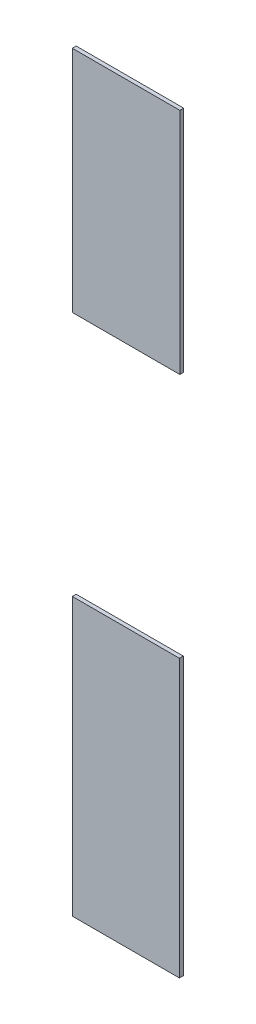
ISO-10303-21;
HEADER;
FILE_DESCRIPTION(('STEP AP214'),'2;1');
FILE_NAME('part.step','',(''),(''),'','','');
FILE_SCHEMA(('AUTOMOTIVE_DESIGN { 1 0 10303 214 1 1 1 1 }'));
ENDSEC;
DATA;
#1=APPLICATION_CONTEXT('core data for automotive mechanical design processes');
#2=APPLICATION_PROTOCOL_DEFINITION('international standard','automotive_design',2000,#1);
#3=PRODUCT_CONTEXT('',#1,'mechanical');
#4=PRODUCT('Part','Part','',(#3));
#5=PRODUCT_RELATED_PRODUCT_CATEGORY('part','',(#4));
#6=PRODUCT_DEFINITION_FORMATION('','',#4);
#7=PRODUCT_DEFINITION_CONTEXT('part definition',#1,'design');
#8=PRODUCT_DEFINITION('design','',#6,#7);
#9=PRODUCT_DEFINITION_SHAPE('','',#8);
#10=(LENGTH_UNIT() NAMED_UNIT(*) SI_UNIT(.MILLI.,.METRE.));
#11=(NAMED_UNIT(*) PLANE_ANGLE_UNIT() SI_UNIT($,.RADIAN.));
#12=(NAMED_UNIT(*) SI_UNIT($,.STERADIAN.) SOLID_ANGLE_UNIT());
#13=UNCERTAINTY_MEASURE_WITH_UNIT(LENGTH_MEASURE(1.E-05),#10,'distance_accuracy_value','');
#14=(GEOMETRIC_REPRESENTATION_CONTEXT(3) GLOBAL_UNCERTAINTY_ASSIGNED_CONTEXT((#13)) GLOBAL_UNIT_ASSIGNED_CONTEXT((#10,
#11,#12)) REPRESENTATION_CONTEXT('',''));
#15=CARTESIAN_POINT('',(0.,0.,0.));
#16=DIRECTION('',(0.,0.,1.));
#17=DIRECTION('',(1.,0.,0.));
#18=AXIS2_PLACEMENT_3D('',#15,#16,#17);
#19=CARTESIAN_POINT('',(-1.49999999999998,-1544.25,12.5));
#20=DIRECTION('',(-1.,0.,0.));
#21=DIRECTION('',(0.,-1.,0.));
#22=AXIS2_PLACEMENT_3D('',#19,#20,#21);
#23=PLANE('',#22);
#24=DIRECTION('',(0.,1.,0.));
#25=VECTOR('',#24,1.);
#26=CARTESIAN_POINT('',(-1.49999999999998,-1544.25,0.));
#27=LINE('',#26,#25);
#28=CARTESIAN_POINT('',(-1.49999999999987,-2445.,0.));
#29=VERTEX_POINT('',#28);
#30=CARTESIAN_POINT('',(-1.49999999999998,-1544.25,0.));
#31=VERTEX_POINT('',#30);
#32=EDGE_CURVE('E109',#29,#31,#27,.T.);
#33=ORIENTED_EDGE('',*,*,#32,.T.);
#34=DIRECTION('',(0.,0.,-1.));
#35=VECTOR('',#34,1.);
#36=CARTESIAN_POINT('',(-1.49999999999998,-1544.25,12.5));
#37=LINE('',#36,#35);
#38=CARTESIAN_POINT('',(-1.49999999999998,-1544.25,12.5));
#39=VERTEX_POINT('',#38);
#40=EDGE_CURVE('E12',#39,#31,#37,.T.);
#41=ORIENTED_EDGE('',*,*,#40,.F.);
#42=DIRECTION('',(0.,1.,0.));
#43=VECTOR('',#42,1.);
#44=CARTESIAN_POINT('',(-1.49999999999998,-1544.25,12.5));
#45=LINE('',#44,#43);
#46=CARTESIAN_POINT('',(-1.49999999999987,-2445.,12.5));
#47=VERTEX_POINT('',#46);
#48=EDGE_CURVE('E97',#47,#39,#45,.T.);
#49=ORIENTED_EDGE('',*,*,#48,.F.);
#50=DIRECTION('',(0.,0.,-1.));
#51=VECTOR('',#50,1.);
#52=CARTESIAN_POINT('',(-1.49999999999987,-2445.,12.5));
#53=LINE('',#52,#51);
#54=EDGE_CURVE('E105',#47,#29,#53,.T.);
#55=ORIENTED_EDGE('',*,*,#54,.T.);
#56=EDGE_LOOP('',(#33,#41,#49,#55));
#57=FACE_BOUND('',#56,.T.);
#58=ADVANCED_FACE('F46',(#57),#23,.F.);
#59=CARTESIAN_POINT('',(-1.49999999999998,-1544.25,12.5));
#60=DIRECTION('',(0.,-1.,0.));
#61=DIRECTION('',(0.,0.,-1.));
#62=AXIS2_PLACEMENT_3D('',#59,#60,#61);
#63=PLANE('',#62);
#64=DIRECTION('',(-1.,0.,0.));
#65=VECTOR('',#64,1.);
#66=CARTESIAN_POINT('',(-1.49999999999998,-1544.25,0.));
#67=LINE('',#66,#65);
#68=CARTESIAN_POINT('',(-350.000000000002,-1544.25,0.));
#69=VERTEX_POINT('',#68);
#70=EDGE_CURVE('E101',#31,#69,#67,.T.);
#71=ORIENTED_EDGE('',*,*,#70,.T.);
#72=DIRECTION('',(0.,0.,-1.));
#73=VECTOR('',#72,1.);
#74=CARTESIAN_POINT('',(-350.000000000002,-1544.25,12.5));
#75=LINE('',#74,#73);
#76=CARTESIAN_POINT('',(-350.000000000002,-1544.25,12.5));
#77=VERTEX_POINT('',#76);
#78=EDGE_CURVE('E54',#77,#69,#75,.T.);
#79=ORIENTED_EDGE('',*,*,#78,.F.);
#80=DIRECTION('',(-1.,0.,0.));
#81=VECTOR('',#80,1.);
#82=CARTESIAN_POINT('',(-1.49999999999998,-1544.25,12.5));
#83=LINE('',#82,#81);
#84=EDGE_CURVE('E92',#39,#77,#83,.T.);
#85=ORIENTED_EDGE('',*,*,#84,.F.);
#86=ORIENTED_EDGE('',*,*,#40,.T.);
#87=EDGE_LOOP('',(#71,#79,#85,#86));
#88=FACE_BOUND('',#87,.T.);
#89=ADVANCED_FACE('F100',(#88),#63,.F.);
#90=CARTESIAN_POINT('',(-350.000000000002,-1544.25,12.5));
#91=DIRECTION('',(1.,0.,0.));
#92=DIRECTION('',(0.,1.,0.));
#93=AXIS2_PLACEMENT_3D('',#90,#91,#92);
#94=PLANE('',#93);
#95=DIRECTION('',(0.,-1.,0.));
#96=VECTOR('',#95,1.);
#97=CARTESIAN_POINT('',(-350.000000000002,-1544.25,0.));
#98=LINE('',#97,#96);
#99=CARTESIAN_POINT('',(-350.000000000001,-2445.,0.));
#100=VERTEX_POINT('',#99);
#101=EDGE_CURVE('E79',#69,#100,#98,.T.);
#102=ORIENTED_EDGE('',*,*,#101,.T.);
#103=DIRECTION('',(0.,0.,-1.));
#104=VECTOR('',#103,1.);
#105=CARTESIAN_POINT('',(-350.000000000001,-2445.,12.5));
#106=LINE('',#105,#104);
#107=CARTESIAN_POINT('',(-350.000000000001,-2445.,12.5));
#108=VERTEX_POINT('',#107);
#109=EDGE_CURVE('E102',#108,#100,#106,.T.);
#110=ORIENTED_EDGE('',*,*,#109,.F.);
#111=DIRECTION('',(0.,-1.,0.));
#112=VECTOR('',#111,1.);
#113=CARTESIAN_POINT('',(-350.000000000002,-1544.25,12.5));
#114=LINE('',#113,#112);
#115=EDGE_CURVE('E95',#77,#108,#114,.T.);
#116=ORIENTED_EDGE('',*,*,#115,.F.);
#117=ORIENTED_EDGE('',*,*,#78,.T.);
#118=EDGE_LOOP('',(#102,#110,#116,#117));
#119=FACE_BOUND('',#118,.T.);
#120=ADVANCED_FACE('F103',(#119),#94,.F.);
#121=CARTESIAN_POINT('',(-1.49999999999987,-2445.,12.5));
#122=DIRECTION('',(0.,1.,0.));
#123=DIRECTION('',(0.,0.,1.));
#124=AXIS2_PLACEMENT_3D('',#121,#122,#123);
#125=PLANE('',#124);
#126=DIRECTION('',(1.,0.,0.));
#127=VECTOR('',#126,1.);
#128=CARTESIAN_POINT('',(-1.49999999999987,-2445.,0.));
#129=LINE('',#128,#127);
#130=EDGE_CURVE('E85',#100,#29,#129,.T.);
#131=ORIENTED_EDGE('',*,*,#130,.T.);
#132=ORIENTED_EDGE('',*,*,#54,.F.);
#133=DIRECTION('',(1.,0.,0.));
#134=VECTOR('',#133,1.);
#135=CARTESIAN_POINT('',(-1.49999999999987,-2445.,12.5));
#136=LINE('',#135,#134);
#137=EDGE_CURVE('E62',#108,#47,#136,.T.);
#138=ORIENTED_EDGE('',*,*,#137,.F.);
#139=ORIENTED_EDGE('',*,*,#109,.T.);
#140=EDGE_LOOP('',(#131,#132,#138,#139));
#141=FACE_BOUND('',#140,.T.);
#142=ADVANCED_FACE('F116',(#141),#125,.F.);
#143=CARTESIAN_POINT('',(0.,0.,12.5));
#144=DIRECTION('',(0.,0.,-1.));
#145=DIRECTION('',(-1.,0.,0.));
#146=AXIS2_PLACEMENT_3D('',#143,#144,#145);
#147=PLANE('',#146);
#148=ORIENTED_EDGE('',*,*,#48,.T.);
#149=ORIENTED_EDGE('',*,*,#84,.T.);
#150=ORIENTED_EDGE('',*,*,#115,.T.);
#151=ORIENTED_EDGE('',*,*,#137,.T.);
#152=EDGE_LOOP('',(#148,#149,#150,#151));
#153=FACE_BOUND('',#152,.T.);
#154=ADVANCED_FACE('F93',(#153),#147,.F.);
#155=CARTESIAN_POINT('',(0.,0.,0.));
#156=DIRECTION('',(0.,0.,-1.));
#157=DIRECTION('',(-1.,0.,0.));
#158=AXIS2_PLACEMENT_3D('',#155,#156,#157);
#159=PLANE('',#158);
#160=ORIENTED_EDGE('',*,*,#32,.F.);
#161=ORIENTED_EDGE('',*,*,#130,.F.);
#162=ORIENTED_EDGE('',*,*,#101,.F.);
#163=ORIENTED_EDGE('',*,*,#70,.F.);
#164=EDGE_LOOP('',(#160,#161,#162,#163));
#165=FACE_BOUND('',#164,.T.);
#166=ADVANCED_FACE('F119',(#165),#159,.T.);
#167=CLOSED_SHELL('',(#58,#89,#120,#142,#154,#166));
#168=MANIFOLD_SOLID_BREP('B2',#167);
#169=CARTESIAN_POINT('',(0.,0.,12.5));
#170=DIRECTION('',(-1.,0.,0.));
#171=DIRECTION('',(0.,-1.,0.));
#172=AXIS2_PLACEMENT_3D('',#169,#170,#171);
#173=PLANE('',#172);
#174=DIRECTION('',(0.,1.,0.));
#175=VECTOR('',#174,1.);
#176=CARTESIAN_POINT('',(0.,0.,0.));
#177=LINE('',#176,#175);
#178=CARTESIAN_POINT('',(0.,-744.25,0.));
#179=VERTEX_POINT('',#178);
#180=CARTESIAN_POINT('',(0.,0.,0.));
#181=VERTEX_POINT('',#180);
#182=EDGE_CURVE('E232',#179,#181,#177,.T.);
#183=ORIENTED_EDGE('',*,*,#182,.T.);
#184=DIRECTION('',(0.,0.,-1.));
#185=VECTOR('',#184,1.);
#186=CARTESIAN_POINT('',(0.,0.,12.5));
#187=LINE('',#186,#185);
#188=CARTESIAN_POINT('',(0.,0.,12.5));
#189=VERTEX_POINT('',#188);
#190=EDGE_CURVE('E44',#189,#181,#187,.T.);
#191=ORIENTED_EDGE('',*,*,#190,.F.);
#192=DIRECTION('',(0.,1.,0.));
#193=VECTOR('',#192,1.);
#194=CARTESIAN_POINT('',(0.,0.,12.5));
#195=LINE('',#194,#193);
#196=CARTESIAN_POINT('',(0.,-744.25,12.5));
#197=VERTEX_POINT('',#196);
#198=EDGE_CURVE('E220',#197,#189,#195,.T.);
#199=ORIENTED_EDGE('',*,*,#198,.F.);
#200=DIRECTION('',(0.,0.,-1.));
#201=VECTOR('',#200,1.);
#202=CARTESIAN_POINT('',(0.,-744.25,12.5));
#203=LINE('',#202,#201);
#204=EDGE_CURVE('E228',#197,#179,#203,.T.);
#205=ORIENTED_EDGE('',*,*,#204,.T.);
#206=EDGE_LOOP('',(#183,#191,#199,#205));
#207=FACE_BOUND('',#206,.T.);
#208=ADVANCED_FACE('F169',(#207),#173,.F.);
#209=CARTESIAN_POINT('',(0.,0.,12.5));
#210=DIRECTION('',(0.,-1.,0.));
#211=DIRECTION('',(0.,0.,-1.));
#212=AXIS2_PLACEMENT_3D('',#209,#210,#211);
#213=PLANE('',#212);
#214=DIRECTION('',(-1.,0.,0.));
#215=VECTOR('',#214,1.);
#216=CARTESIAN_POINT('',(0.,0.,0.));
#217=LINE('',#216,#215);
#218=CARTESIAN_POINT('',(-350.000000000002,0.,0.));
#219=VERTEX_POINT('',#218);
#220=EDGE_CURVE('E224',#181,#219,#217,.T.);
#221=ORIENTED_EDGE('',*,*,#220,.T.);
#222=DIRECTION('',(0.,0.,-1.));
#223=VECTOR('',#222,1.);
#224=CARTESIAN_POINT('',(-350.000000000002,0.,12.5));
#225=LINE('',#224,#223);
#226=CARTESIAN_POINT('',(-350.000000000002,0.,12.5));
#227=VERTEX_POINT('',#226);
#228=EDGE_CURVE('E177',#227,#219,#225,.T.);
#229=ORIENTED_EDGE('',*,*,#228,.F.);
#230=DIRECTION('',(-1.,0.,0.));
#231=VECTOR('',#230,1.);
#232=CARTESIAN_POINT('',(0.,0.,12.5));
#233=LINE('',#232,#231);
#234=EDGE_CURVE('E215',#189,#227,#233,.T.);
#235=ORIENTED_EDGE('',*,*,#234,.F.);
#236=ORIENTED_EDGE('',*,*,#190,.T.);
#237=EDGE_LOOP('',(#221,#229,#235,#236));
#238=FACE_BOUND('',#237,.T.);
#239=ADVANCED_FACE('F223',(#238),#213,.F.);
#240=CARTESIAN_POINT('',(-350.000000000002,0.,12.5));
#241=DIRECTION('',(1.,0.,0.));
#242=DIRECTION('',(0.,0.,-1.));
#243=AXIS2_PLACEMENT_3D('',#240,#241,#242);
#244=PLANE('',#243);
#245=DIRECTION('',(0.,-1.,0.));
#246=VECTOR('',#245,1.);
#247=CARTESIAN_POINT('',(-350.000000000002,0.,0.));
#248=LINE('',#247,#246);
#249=CARTESIAN_POINT('',(-350.000000000002,-744.25,0.));
#250=VERTEX_POINT('',#249);
#251=EDGE_CURVE('E202',#219,#250,#248,.T.);
#252=ORIENTED_EDGE('',*,*,#251,.T.);
#253=DIRECTION('',(0.,0.,-1.));
#254=VECTOR('',#253,1.);
#255=CARTESIAN_POINT('',(-350.000000000002,-744.25,12.5));
#256=LINE('',#255,#254);
#257=CARTESIAN_POINT('',(-350.000000000002,-744.25,12.5));
#258=VERTEX_POINT('',#257);
#259=EDGE_CURVE('E225',#258,#250,#256,.T.);
#260=ORIENTED_EDGE('',*,*,#259,.F.);
#261=DIRECTION('',(0.,-1.,0.));
#262=VECTOR('',#261,1.);
#263=CARTESIAN_POINT('',(-350.000000000002,0.,12.5));
#264=LINE('',#263,#262);
#265=EDGE_CURVE('E218',#227,#258,#264,.T.);
#266=ORIENTED_EDGE('',*,*,#265,.F.);
#267=ORIENTED_EDGE('',*,*,#228,.T.);
#268=EDGE_LOOP('',(#252,#260,#266,#267));
#269=FACE_BOUND('',#268,.T.);
#270=ADVANCED_FACE('F226',(#269),#244,.F.);
#271=CARTESIAN_POINT('',(0.,-744.25,12.5));
#272=DIRECTION('',(0.,1.,0.));
#273=DIRECTION('',(0.,0.,1.));
#274=AXIS2_PLACEMENT_3D('',#271,#272,#273);
#275=PLANE('',#274);
#276=DIRECTION('',(1.,0.,0.));
#277=VECTOR('',#276,1.);
#278=CARTESIAN_POINT('',(0.,-744.25,0.));
#279=LINE('',#278,#277);
#280=EDGE_CURVE('E208',#250,#179,#279,.T.);
#281=ORIENTED_EDGE('',*,*,#280,.T.);
#282=ORIENTED_EDGE('',*,*,#204,.F.);
#283=DIRECTION('',(1.,0.,0.));
#284=VECTOR('',#283,1.);
#285=CARTESIAN_POINT('',(0.,-744.25,12.5));
#286=LINE('',#285,#284);
#287=EDGE_CURVE('E185',#258,#197,#286,.T.);
#288=ORIENTED_EDGE('',*,*,#287,.F.);
#289=ORIENTED_EDGE('',*,*,#259,.T.);
#290=EDGE_LOOP('',(#281,#282,#288,#289));
#291=FACE_BOUND('',#290,.T.);
#292=ADVANCED_FACE('F239',(#291),#275,.F.);
#293=CARTESIAN_POINT('',(0.,0.,12.5));
#294=DIRECTION('',(0.,0.,-1.));
#295=DIRECTION('',(-1.,0.,0.));
#296=AXIS2_PLACEMENT_3D('',#293,#294,#295);
#297=PLANE('',#296);
#298=ORIENTED_EDGE('',*,*,#198,.T.);
#299=ORIENTED_EDGE('',*,*,#234,.T.);
#300=ORIENTED_EDGE('',*,*,#265,.T.);
#301=ORIENTED_EDGE('',*,*,#287,.T.);
#302=EDGE_LOOP('',(#298,#299,#300,#301));
#303=FACE_BOUND('',#302,.T.);
#304=ADVANCED_FACE('F216',(#303),#297,.F.);
#305=CARTESIAN_POINT('',(0.,0.,0.));
#306=DIRECTION('',(0.,0.,-1.));
#307=DIRECTION('',(-1.,0.,0.));
#308=AXIS2_PLACEMENT_3D('',#305,#306,#307);
#309=PLANE('',#308);
#310=ORIENTED_EDGE('',*,*,#182,.F.);
#311=ORIENTED_EDGE('',*,*,#280,.F.);
#312=ORIENTED_EDGE('',*,*,#251,.F.);
#313=ORIENTED_EDGE('',*,*,#220,.F.);
#314=EDGE_LOOP('',(#310,#311,#312,#313));
#315=FACE_BOUND('',#314,.T.);
#316=ADVANCED_FACE('F242',(#315),#309,.T.);
#317=CLOSED_SHELL('',(#208,#239,#270,#292,#304,#316));
#318=MANIFOLD_SOLID_BREP('B6',#317);
#319=ADVANCED_BREP_SHAPE_REPRESENTATION('',(#18,#168,#318),#14);
#320=SHAPE_DEFINITION_REPRESENTATION(#9,#319);
ENDSEC;
END-ISO-10303-21;
